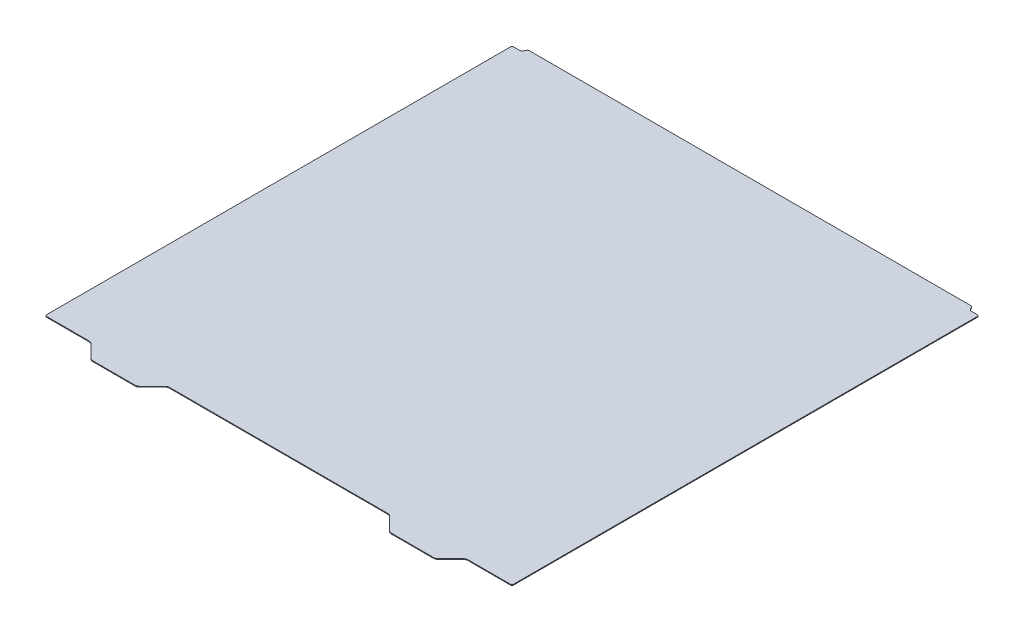
ISO-10303-21;
HEADER;
FILE_DESCRIPTION(('STEP AP214'),'2;1');
FILE_NAME('part.step','',(''),(''),'','','');
FILE_SCHEMA(('AUTOMOTIVE_DESIGN { 1 0 10303 214 1 1 1 1 }'));
ENDSEC;
DATA;
#1=APPLICATION_CONTEXT('core data for automotive mechanical design processes');
#2=APPLICATION_PROTOCOL_DEFINITION('international standard','automotive_design',2000,#1);
#3=PRODUCT_CONTEXT('',#1,'mechanical');
#4=PRODUCT('Part','Part','',(#3));
#5=PRODUCT_RELATED_PRODUCT_CATEGORY('part','',(#4));
#6=PRODUCT_DEFINITION_FORMATION('','',#4);
#7=PRODUCT_DEFINITION_CONTEXT('part definition',#1,'design');
#8=PRODUCT_DEFINITION('design','',#6,#7);
#9=PRODUCT_DEFINITION_SHAPE('','',#8);
#10=(LENGTH_UNIT() NAMED_UNIT(*) SI_UNIT(.MILLI.,.METRE.));
#11=(NAMED_UNIT(*) PLANE_ANGLE_UNIT() SI_UNIT($,.RADIAN.));
#12=(NAMED_UNIT(*) SI_UNIT($,.STERADIAN.) SOLID_ANGLE_UNIT());
#13=UNCERTAINTY_MEASURE_WITH_UNIT(LENGTH_MEASURE(1.E-05),#10,'distance_accuracy_value','');
#14=(GEOMETRIC_REPRESENTATION_CONTEXT(3) GLOBAL_UNCERTAINTY_ASSIGNED_CONTEXT((#13)) GLOBAL_UNIT_ASSIGNED_CONTEXT((#10,
#11,#12)) REPRESENTATION_CONTEXT('',''));
#15=CARTESIAN_POINT('',(0.,0.,0.));
#16=DIRECTION('',(0.,0.,1.));
#17=DIRECTION('',(1.,0.,0.));
#18=AXIS2_PLACEMENT_3D('',#15,#16,#17);
#19=CARTESIAN_POINT('',(-152.5,0.5,-152.5));
#20=DIRECTION('',(0.,0.,1.));
#21=DIRECTION('',(1.,0.,0.));
#22=AXIS2_PLACEMENT_3D('',#19,#20,#21);
#23=PLANE('',#22);
#24=DIRECTION('',(-1.,0.,0.));
#25=VECTOR('',#24,1.);
#26=CARTESIAN_POINT('',(-152.5,0.5,-152.5));
#27=LINE('',#26,#25);
#28=CARTESIAN_POINT('',(-147.500000003784,0.5,-152.5));
#29=VERTEX_POINT('',#28);
#30=CARTESIAN_POINT('',(-151.5,0.5,-152.5));
#31=VERTEX_POINT('',#30);
#32=EDGE_CURVE('E544',#29,#31,#27,.T.);
#33=ORIENTED_EDGE('',*,*,#32,.F.);
#34=DIRECTION('',(0.,1.,0.));
#35=VECTOR('',#34,1.);
#36=CARTESIAN_POINT('',(-147.500000003784,0.,-152.5));
#37=LINE('',#36,#35);
#38=CARTESIAN_POINT('',(-147.500000003784,0.,-152.5));
#39=VERTEX_POINT('',#38);
#40=EDGE_CURVE('E409',#29,#39,#37,.F.);
#41=ORIENTED_EDGE('',*,*,#40,.T.);
#42=DIRECTION('',(-1.,0.,0.));
#43=VECTOR('',#42,1.);
#44=CARTESIAN_POINT('',(-152.5,0.,-152.5));
#45=LINE('',#44,#43);
#46=CARTESIAN_POINT('',(-151.5,0.,-152.5));
#47=VERTEX_POINT('',#46);
#48=EDGE_CURVE('E557',#39,#47,#45,.T.);
#49=ORIENTED_EDGE('',*,*,#48,.T.);
#50=DIRECTION('',(0.,-1.,0.));
#51=VECTOR('',#50,1.);
#52=CARTESIAN_POINT('',(-151.5,0.5,-152.5));
#53=LINE('',#52,#51);
#54=EDGE_CURVE('E393',#47,#31,#53,.F.);
#55=ORIENTED_EDGE('',*,*,#54,.T.);
#56=EDGE_LOOP('',(#33,#41,#49,#55));
#57=FACE_BOUND('',#56,.T.);
#58=ADVANCED_FACE('F103',(#57),#23,.F.);
#59=CARTESIAN_POINT('',(-152.5,0.5,152.5));
#60=DIRECTION('',(0.,0.,-1.));
#61=DIRECTION('',(-1.,0.,0.));
#62=AXIS2_PLACEMENT_3D('',#59,#60,#61);
#63=PLANE('',#62);
#64=DIRECTION('',(1.,0.,0.));
#65=VECTOR('',#64,1.);
#66=CARTESIAN_POINT('',(-152.5,0.5,152.5));
#67=LINE('',#66,#65);
#68=CARTESIAN_POINT('',(-71.2573593128807,0.5,152.5));
#69=VERTEX_POINT('',#68);
#70=CARTESIAN_POINT('',(71.2573593128807,0.5,152.5));
#71=VERTEX_POINT('',#70);
#72=EDGE_CURVE('E346',#69,#71,#67,.T.);
#73=ORIENTED_EDGE('',*,*,#72,.F.);
#74=DIRECTION('',(0.,1.,0.));
#75=VECTOR('',#74,1.);
#76=CARTESIAN_POINT('',(-71.2573593128807,0.,152.5));
#77=LINE('',#76,#75);
#78=CARTESIAN_POINT('',(-71.2573593128807,0.,152.5));
#79=VERTEX_POINT('',#78);
#80=EDGE_CURVE('E494',#69,#79,#77,.F.);
#81=ORIENTED_EDGE('',*,*,#80,.T.);
#82=DIRECTION('',(1.,0.,0.));
#83=VECTOR('',#82,1.);
#84=CARTESIAN_POINT('',(-152.5,0.,152.5));
#85=LINE('',#84,#83);
#86=CARTESIAN_POINT('',(71.2573593128807,0.,152.5));
#87=VERTEX_POINT('',#86);
#88=EDGE_CURVE('E566',#79,#87,#85,.T.);
#89=ORIENTED_EDGE('',*,*,#88,.T.);
#90=DIRECTION('',(0.,1.,0.));
#91=VECTOR('',#90,1.);
#92=CARTESIAN_POINT('',(71.2573593128807,0.5,152.5));
#93=LINE('',#92,#91);
#94=EDGE_CURVE('E496',#87,#71,#93,.T.);
#95=ORIENTED_EDGE('',*,*,#94,.T.);
#96=EDGE_LOOP('',(#73,#81,#89,#95));
#97=FACE_BOUND('',#96,.T.);
#98=ADVANCED_FACE('F662',(#97),#63,.F.);
#99=CARTESIAN_POINT('',(123.742640687119,0.5,152.5));
#100=VERTEX_POINT('',#99);
#101=CARTESIAN_POINT('',(151.5,0.5,152.5));
#102=VERTEX_POINT('',#101);
#103=EDGE_CURVE('E348',#100,#102,#67,.T.);
#104=ORIENTED_EDGE('',*,*,#103,.F.);
#105=DIRECTION('',(0.,1.,0.));
#106=VECTOR('',#105,1.);
#107=CARTESIAN_POINT('',(123.742640687119,0.,152.5));
#108=LINE('',#107,#106);
#109=CARTESIAN_POINT('',(123.742640687119,0.,152.5));
#110=VERTEX_POINT('',#109);
#111=EDGE_CURVE('E477',#100,#110,#108,.F.);
#112=ORIENTED_EDGE('',*,*,#111,.T.);
#113=CARTESIAN_POINT('',(151.5,0.,152.5));
#114=VERTEX_POINT('',#113);
#115=EDGE_CURVE('E562',#110,#114,#85,.T.);
#116=ORIENTED_EDGE('',*,*,#115,.T.);
#117=DIRECTION('',(0.,-1.,0.));
#118=VECTOR('',#117,1.);
#119=CARTESIAN_POINT('',(151.5,0.5,152.5));
#120=LINE('',#119,#118);
#121=EDGE_CURVE('E396',#114,#102,#120,.F.);
#122=ORIENTED_EDGE('',*,*,#121,.T.);
#123=EDGE_LOOP('',(#104,#112,#116,#122));
#124=FACE_BOUND('',#123,.T.);
#125=ADVANCED_FACE('F654',(#124),#63,.F.);
#126=CARTESIAN_POINT('',(152.5,0.5,152.5));
#127=DIRECTION('',(-1.,0.,0.));
#128=DIRECTION('',(0.,0.,1.));
#129=AXIS2_PLACEMENT_3D('',#126,#127,#128);
#130=PLANE('',#129);
#131=DIRECTION('',(0.,0.,-1.));
#132=VECTOR('',#131,1.);
#133=CARTESIAN_POINT('',(152.5,0.,152.5));
#134=LINE('',#133,#132);
#135=CARTESIAN_POINT('',(152.5,0.,151.5));
#136=VERTEX_POINT('',#135);
#137=CARTESIAN_POINT('',(152.5,0.,-151.5));
#138=VERTEX_POINT('',#137);
#139=EDGE_CURVE('E462',#136,#138,#134,.T.);
#140=ORIENTED_EDGE('',*,*,#139,.T.);
#141=DIRECTION('',(0.,-1.,0.));
#142=VECTOR('',#141,1.);
#143=CARTESIAN_POINT('',(152.5,0.5,-151.5));
#144=LINE('',#143,#142);
#145=CARTESIAN_POINT('',(152.5,0.5,-151.5));
#146=VERTEX_POINT('',#145);
#147=EDGE_CURVE('E383',#138,#146,#144,.F.);
#148=ORIENTED_EDGE('',*,*,#147,.T.);
#149=DIRECTION('',(0.,0.,-1.));
#150=VECTOR('',#149,1.);
#151=CARTESIAN_POINT('',(152.5,0.5,152.5));
#152=LINE('',#151,#150);
#153=CARTESIAN_POINT('',(152.5,0.5,151.5));
#154=VERTEX_POINT('',#153);
#155=EDGE_CURVE('E545',#154,#146,#152,.T.);
#156=ORIENTED_EDGE('',*,*,#155,.F.);
#157=DIRECTION('',(0.,-1.,0.));
#158=VECTOR('',#157,1.);
#159=CARTESIAN_POINT('',(152.5,0.5,151.5));
#160=LINE('',#159,#158);
#161=EDGE_CURVE('E380',#154,#136,#160,.T.);
#162=ORIENTED_EDGE('',*,*,#161,.T.);
#163=EDGE_LOOP('',(#140,#148,#156,#162));
#164=FACE_BOUND('',#163,.T.);
#165=ADVANCED_FACE('F698',(#164),#130,.F.);
#166=CARTESIAN_POINT('',(151.5,0.,-152.5));
#167=VERTEX_POINT('',#166);
#168=CARTESIAN_POINT('',(147.500000003784,0.,-152.5));
#169=VERTEX_POINT('',#168);
#170=EDGE_CURVE('E558',#167,#169,#45,.T.);
#171=ORIENTED_EDGE('',*,*,#170,.T.);
#172=DIRECTION('',(0.,1.,0.));
#173=VECTOR('',#172,1.);
#174=CARTESIAN_POINT('',(147.500000003784,0.5,-152.5));
#175=LINE('',#174,#173);
#176=CARTESIAN_POINT('',(147.500000003784,0.5,-152.5));
#177=VERTEX_POINT('',#176);
#178=EDGE_CURVE('E402',#169,#177,#175,.T.);
#179=ORIENTED_EDGE('',*,*,#178,.T.);
#180=CARTESIAN_POINT('',(151.5,0.5,-152.5));
#181=VERTEX_POINT('',#180);
#182=EDGE_CURVE('E539',#181,#177,#27,.T.);
#183=ORIENTED_EDGE('',*,*,#182,.F.);
#184=DIRECTION('',(0.,-1.,0.));
#185=VECTOR('',#184,1.);
#186=CARTESIAN_POINT('',(151.5,0.5,-152.5));
#187=LINE('',#186,#185);
#188=EDGE_CURVE('E334',#181,#167,#187,.T.);
#189=ORIENTED_EDGE('',*,*,#188,.T.);
#190=EDGE_LOOP('',(#171,#179,#183,#189));
#191=FACE_BOUND('',#190,.T.);
#192=ADVANCED_FACE('F690',(#191),#23,.F.);
#193=CARTESIAN_POINT('',(-152.5,0.5,152.5));
#194=DIRECTION('',(1.,0.,0.));
#195=DIRECTION('',(0.,0.,-1.));
#196=AXIS2_PLACEMENT_3D('',#193,#194,#195);
#197=PLANE('',#196);
#198=DIRECTION('',(0.,0.,1.));
#199=VECTOR('',#198,1.);
#200=CARTESIAN_POINT('',(-152.5,0.5,152.5));
#201=LINE('',#200,#199);
#202=CARTESIAN_POINT('',(-152.5,0.5,-151.5));
#203=VERTEX_POINT('',#202);
#204=CARTESIAN_POINT('',(-152.5,0.5,151.5));
#205=VERTEX_POINT('',#204);
#206=EDGE_CURVE('E543',#203,#205,#201,.T.);
#207=ORIENTED_EDGE('',*,*,#206,.F.);
#208=DIRECTION('',(0.,-1.,0.));
#209=VECTOR('',#208,1.);
#210=CARTESIAN_POINT('',(-152.5,0.5,-151.5));
#211=LINE('',#210,#209);
#212=CARTESIAN_POINT('',(-152.5,0.,-151.5));
#213=VERTEX_POINT('',#212);
#214=EDGE_CURVE('E390',#203,#213,#211,.T.);
#215=ORIENTED_EDGE('',*,*,#214,.T.);
#216=DIRECTION('',(0.,0.,1.));
#217=VECTOR('',#216,1.);
#218=CARTESIAN_POINT('',(-152.5,0.,152.5));
#219=LINE('',#218,#217);
#220=CARTESIAN_POINT('',(-152.5,0.,151.5));
#221=VERTEX_POINT('',#220);
#222=EDGE_CURVE('E560',#213,#221,#219,.T.);
#223=ORIENTED_EDGE('',*,*,#222,.T.);
#224=DIRECTION('',(0.,-1.,0.));
#225=VECTOR('',#224,1.);
#226=CARTESIAN_POINT('',(-152.5,0.5,151.5));
#227=LINE('',#226,#225);
#228=EDGE_CURVE('E388',#221,#205,#227,.F.);
#229=ORIENTED_EDGE('',*,*,#228,.T.);
#230=EDGE_LOOP('',(#207,#215,#223,#229));
#231=FACE_BOUND('',#230,.T.);
#232=ADVANCED_FACE('F591',(#231),#197,.F.);
#233=CARTESIAN_POINT('',(-151.5,0.,152.5));
#234=VERTEX_POINT('',#233);
#235=CARTESIAN_POINT('',(-123.742640687119,0.,152.5));
#236=VERTEX_POINT('',#235);
#237=EDGE_CURVE('E350',#234,#236,#85,.T.);
#238=ORIENTED_EDGE('',*,*,#237,.T.);
#239=DIRECTION('',(0.,1.,0.));
#240=VECTOR('',#239,1.);
#241=CARTESIAN_POINT('',(-123.742640687119,0.5,152.5));
#242=LINE('',#241,#240);
#243=CARTESIAN_POINT('',(-123.742640687119,0.5,152.5));
#244=VERTEX_POINT('',#243);
#245=EDGE_CURVE('E529',#236,#244,#242,.T.);
#246=ORIENTED_EDGE('',*,*,#245,.T.);
#247=CARTESIAN_POINT('',(-151.5,0.5,152.5));
#248=VERTEX_POINT('',#247);
#249=EDGE_CURVE('E341',#248,#244,#67,.T.);
#250=ORIENTED_EDGE('',*,*,#249,.F.);
#251=DIRECTION('',(0.,-1.,0.));
#252=VECTOR('',#251,1.);
#253=CARTESIAN_POINT('',(-151.5,0.5,152.5));
#254=LINE('',#253,#252);
#255=EDGE_CURVE('E399',#248,#234,#254,.T.);
#256=ORIENTED_EDGE('',*,*,#255,.T.);
#257=EDGE_LOOP('',(#238,#246,#250,#256));
#258=FACE_BOUND('',#257,.T.);
#259=ADVANCED_FACE('F597',(#258),#63,.F.);
#260=CARTESIAN_POINT('',(0.,0.5,0.));
#261=DIRECTION('',(0.,-1.,0.));
#262=DIRECTION('',(0.,0.,-1.));
#263=AXIS2_PLACEMENT_3D('',#260,#261,#262);
#264=PLANE('',#263);
#265=DIRECTION('',(0.707106781186552,0.,0.707106781186543));
#266=VECTOR('',#265,1.);
#267=CARTESIAN_POINT('',(-137.499999999999,0.5,137.500000000001));
#268=LINE('',#267,#266);
#269=CARTESIAN_POINT('',(-121.62132034356,0.5,153.37867965644));
#270=VERTEX_POINT('',#269);
#271=CARTESIAN_POINT('',(-113.37867965644,0.5,161.62132034356));
#272=VERTEX_POINT('',#271);
#273=EDGE_CURVE('E428',#270,#272,#268,.T.);
#274=ORIENTED_EDGE('',*,*,#273,.T.);
#275=CARTESIAN_POINT('',(-111.257359312881,0.5,159.5));
#276=DIRECTION('',(0.,-1.,0.));
#277=DIRECTION('',(0.,0.,-1.));
#278=AXIS2_PLACEMENT_3D('',#275,#276,#277);
#279=CIRCLE('',#278,3.);
#280=CARTESIAN_POINT('',(-111.257359312881,0.5,162.5));
#281=VERTEX_POINT('',#280);
#282=EDGE_CURVE('E516',#272,#281,#279,.F.);
#283=ORIENTED_EDGE('',*,*,#282,.T.);
#284=DIRECTION('',(-1.,0.,0.));
#285=VECTOR('',#284,1.);
#286=CARTESIAN_POINT('',(0.,0.5,162.5));
#287=LINE('',#286,#285);
#288=CARTESIAN_POINT('',(-83.7426406871194,0.5,162.5));
#289=VERTEX_POINT('',#288);
#290=EDGE_CURVE('E463',#289,#281,#287,.T.);
#291=ORIENTED_EDGE('',*,*,#290,.F.);
#292=CARTESIAN_POINT('',(-83.7426406871194,0.5,159.5));
#293=DIRECTION('',(0.,-1.,0.));
#294=DIRECTION('',(0.,0.,-1.));
#295=AXIS2_PLACEMENT_3D('',#292,#293,#294);
#296=CIRCLE('',#295,3.);
#297=CARTESIAN_POINT('',(-81.6213203435598,0.5,161.62132034356));
#298=VERTEX_POINT('',#297);
#299=EDGE_CURVE('E518',#289,#298,#296,.F.);
#300=ORIENTED_EDGE('',*,*,#299,.T.);
#301=DIRECTION('',(-0.707106781186552,0.,0.707106781186543));
#302=VECTOR('',#301,1.);
#303=CARTESIAN_POINT('',(40.0000000000005,0.5,40.0000000000011));
#304=LINE('',#303,#302);
#305=CARTESIAN_POINT('',(-73.3786796564404,0.5,153.37867965644));
#306=VERTEX_POINT('',#305);
#307=EDGE_CURVE('E459',#306,#298,#304,.T.);
#308=ORIENTED_EDGE('',*,*,#307,.F.);
#309=CARTESIAN_POINT('',(-71.2573593128807,0.5,155.5));
#310=DIRECTION('',(0.,-1.,0.));
#311=DIRECTION('',(0.,0.,-1.));
#312=AXIS2_PLACEMENT_3D('',#309,#310,#311);
#313=CIRCLE('',#312,3.);
#314=EDGE_CURVE('E470',#306,#69,#313,.T.);
#315=ORIENTED_EDGE('',*,*,#314,.T.);
#316=ORIENTED_EDGE('',*,*,#72,.T.);
#317=CARTESIAN_POINT('',(71.2573593128807,0.5,155.5));
#318=DIRECTION('',(0.,-1.,0.));
#319=DIRECTION('',(0.,0.,-1.));
#320=AXIS2_PLACEMENT_3D('',#317,#318,#319);
#321=CIRCLE('',#320,3.);
#322=CARTESIAN_POINT('',(73.3786796564404,0.5,153.37867965644));
#323=VERTEX_POINT('',#322);
#324=EDGE_CURVE('E447',#71,#323,#321,.T.);
#325=ORIENTED_EDGE('',*,*,#324,.T.);
#326=DIRECTION('',(0.707106781186553,0.,0.707106781186542));
#327=VECTOR('',#326,1.);
#328=CARTESIAN_POINT('',(-40.0000000000006,0.5,40.0000000000013));
#329=LINE('',#328,#327);
#330=CARTESIAN_POINT('',(81.6213203435598,0.5,161.62132034356));
#331=VERTEX_POINT('',#330);
#332=EDGE_CURVE('E454',#323,#331,#329,.T.);
#333=ORIENTED_EDGE('',*,*,#332,.T.);
#334=CARTESIAN_POINT('',(83.7426406871194,0.5,159.5));
#335=DIRECTION('',(0.,-1.,0.));
#336=DIRECTION('',(0.,0.,-1.));
#337=AXIS2_PLACEMENT_3D('',#334,#335,#336);
#338=CIRCLE('',#337,3.);
#339=CARTESIAN_POINT('',(83.7426406871194,0.5,162.5));
#340=VERTEX_POINT('',#339);
#341=EDGE_CURVE('E520',#331,#340,#338,.F.);
#342=ORIENTED_EDGE('',*,*,#341,.T.);
#343=DIRECTION('',(1.,0.,0.));
#344=VECTOR('',#343,1.);
#345=CARTESIAN_POINT('',(0.,0.5,162.5));
#346=LINE('',#345,#344);
#347=CARTESIAN_POINT('',(111.257359312881,0.5,162.5));
#348=VERTEX_POINT('',#347);
#349=EDGE_CURVE('E429',#340,#348,#346,.T.);
#350=ORIENTED_EDGE('',*,*,#349,.T.);
#351=CARTESIAN_POINT('',(111.257359312881,0.5,159.5));
#352=DIRECTION('',(0.,-1.,0.));
#353=DIRECTION('',(0.,0.,-1.));
#354=AXIS2_PLACEMENT_3D('',#351,#352,#353);
#355=CIRCLE('',#354,3.);
#356=CARTESIAN_POINT('',(113.37867965644,0.5,161.62132034356));
#357=VERTEX_POINT('',#356);
#358=EDGE_CURVE('E522',#348,#357,#355,.F.);
#359=ORIENTED_EDGE('',*,*,#358,.T.);
#360=DIRECTION('',(-0.707106781186553,0.,0.707106781186542));
#361=VECTOR('',#360,1.);
#362=CARTESIAN_POINT('',(137.499999999999,0.5,137.500000000001));
#363=LINE('',#362,#361);
#364=CARTESIAN_POINT('',(121.62132034356,0.5,153.37867965644));
#365=VERTEX_POINT('',#364);
#366=EDGE_CURVE('E323',#365,#357,#363,.T.);
#367=ORIENTED_EDGE('',*,*,#366,.F.);
#368=CARTESIAN_POINT('',(123.742640687119,0.5,155.5));
#369=DIRECTION('',(0.,-1.,0.));
#370=DIRECTION('',(0.,0.,-1.));
#371=AXIS2_PLACEMENT_3D('',#368,#369,#370);
#372=CIRCLE('',#371,3.);
#373=EDGE_CURVE('E111',#365,#100,#372,.T.);
#374=ORIENTED_EDGE('',*,*,#373,.T.);
#375=ORIENTED_EDGE('',*,*,#103,.T.);
#376=CARTESIAN_POINT('',(151.5,0.5,151.5));
#377=DIRECTION('',(0.,-1.,0.));
#378=DIRECTION('',(0.,0.,-1.));
#379=AXIS2_PLACEMENT_3D('',#376,#377,#378);
#380=CIRCLE('',#379,1.);
#381=EDGE_CURVE('E343',#102,#154,#380,.F.);
#382=ORIENTED_EDGE('',*,*,#381,.T.);
#383=ORIENTED_EDGE('',*,*,#155,.T.);
#384=CARTESIAN_POINT('',(151.5,0.5,-151.5));
#385=DIRECTION('',(0.,-1.,0.));
#386=DIRECTION('',(0.,0.,-1.));
#387=AXIS2_PLACEMENT_3D('',#384,#385,#386);
#388=CIRCLE('',#387,1.);
#389=EDGE_CURVE('E359',#146,#181,#388,.F.);
#390=ORIENTED_EDGE('',*,*,#389,.T.);
#391=ORIENTED_EDGE('',*,*,#182,.T.);
#392=CARTESIAN_POINT('',(147.500000003784,0.5,-154.));
#393=DIRECTION('',(0.,-1.,0.));
#394=DIRECTION('',(0.,0.,-1.));
#395=AXIS2_PLACEMENT_3D('',#392,#393,#394);
#396=CIRCLE('',#395,1.5);
#397=CARTESIAN_POINT('',(146.200961898108,0.5,-153.25));
#398=VERTEX_POINT('',#397);
#399=EDGE_CURVE('E411',#177,#398,#396,.T.);
#400=ORIENTED_EDGE('',*,*,#399,.T.);
#401=DIRECTION('',(-0.499999999999995,0.,-0.866025403784441));
#402=VECTOR('',#401,1.);
#403=CARTESIAN_POINT('',(176.009917988564,0.5,-101.61937353074));
#404=LINE('',#403,#402);
#405=CARTESIAN_POINT('',(145.190598927026,0.5,-155.));
#406=VERTEX_POINT('',#405);
#407=EDGE_CURVE('E425',#398,#406,#404,.T.);
#408=ORIENTED_EDGE('',*,*,#407,.T.);
#409=CARTESIAN_POINT('',(144.324573523242,0.5,-154.5));
#410=DIRECTION('',(0.,-1.,0.));
#411=DIRECTION('',(0.,0.,-1.));
#412=AXIS2_PLACEMENT_3D('',#409,#410,#411);
#413=CIRCLE('',#412,1.);
#414=CARTESIAN_POINT('',(144.324573523242,0.5,-155.5));
#415=VERTEX_POINT('',#414);
#416=EDGE_CURVE('E339',#406,#415,#413,.F.);
#417=ORIENTED_EDGE('',*,*,#416,.T.);
#418=DIRECTION('',(1.,0.,0.));
#419=VECTOR('',#418,1.);
#420=CARTESIAN_POINT('',(0.,0.5,-155.5));
#421=LINE('',#420,#419);
#422=CARTESIAN_POINT('',(-144.324573523242,0.5,-155.5));
#423=VERTEX_POINT('',#422);
#424=EDGE_CURVE('E322',#423,#415,#421,.T.);
#425=ORIENTED_EDGE('',*,*,#424,.F.);
#426=CARTESIAN_POINT('',(-144.324573523242,0.5,-154.5));
#427=DIRECTION('',(0.,-1.,0.));
#428=DIRECTION('',(0.,0.,-1.));
#429=AXIS2_PLACEMENT_3D('',#426,#427,#428);
#430=CIRCLE('',#429,1.);
#431=CARTESIAN_POINT('',(-145.190598927026,0.5,-155.));
#432=VERTEX_POINT('',#431);
#433=EDGE_CURVE('E356',#423,#432,#430,.F.);
#434=ORIENTED_EDGE('',*,*,#433,.T.);
#435=DIRECTION('',(0.499999999999995,0.,-0.866025403784441));
#436=VECTOR('',#435,1.);
#437=CARTESIAN_POINT('',(-176.009917988564,0.5,-101.61937353074));
#438=LINE('',#437,#436);
#439=CARTESIAN_POINT('',(-146.200961898108,0.5,-153.25));
#440=VERTEX_POINT('',#439);
#441=EDGE_CURVE('E612',#440,#432,#438,.T.);
#442=ORIENTED_EDGE('',*,*,#441,.F.);
#443=CARTESIAN_POINT('',(-147.500000003784,0.5,-154.));
#444=DIRECTION('',(0.,-1.,0.));
#445=DIRECTION('',(0.,0.,-1.));
#446=AXIS2_PLACEMENT_3D('',#443,#444,#445);
#447=CIRCLE('',#446,1.5);
#448=EDGE_CURVE('E533',#440,#29,#447,.T.);
#449=ORIENTED_EDGE('',*,*,#448,.T.);
#450=ORIENTED_EDGE('',*,*,#32,.T.);
#451=CARTESIAN_POINT('',(-151.5,0.5,-151.5));
#452=DIRECTION('',(0.,-1.,0.));
#453=DIRECTION('',(0.,0.,-1.));
#454=AXIS2_PLACEMENT_3D('',#451,#452,#453);
#455=CIRCLE('',#454,1.);
#456=EDGE_CURVE('E354',#31,#203,#455,.F.);
#457=ORIENTED_EDGE('',*,*,#456,.T.);
#458=ORIENTED_EDGE('',*,*,#206,.T.);
#459=CARTESIAN_POINT('',(-151.5,0.5,151.5));
#460=DIRECTION('',(0.,-1.,0.));
#461=DIRECTION('',(0.,0.,-1.));
#462=AXIS2_PLACEMENT_3D('',#459,#460,#461);
#463=CIRCLE('',#462,1.);
#464=EDGE_CURVE('E340',#205,#248,#463,.F.);
#465=ORIENTED_EDGE('',*,*,#464,.T.);
#466=ORIENTED_EDGE('',*,*,#249,.T.);
#467=CARTESIAN_POINT('',(-123.742640687119,0.5,155.5));
#468=DIRECTION('',(0.,-1.,0.));
#469=DIRECTION('',(0.,0.,-1.));
#470=AXIS2_PLACEMENT_3D('',#467,#468,#469);
#471=CIRCLE('',#470,3.);
#472=EDGE_CURVE('E474',#244,#270,#471,.T.);
#473=ORIENTED_EDGE('',*,*,#472,.T.);
#474=EDGE_LOOP('',(#274,#283,#291,#300,#308,#315,#316,#325,#333,#342,#350,#359,#367,#374,#375,
#382,#383,#390,#391,#400,#408,#417,#425,#434,#442,#449,#450,#457,#458,#465,#466,#473));
#475=FACE_BOUND('',#474,.T.);
#476=ADVANCED_FACE('F580',(#475),#264,.F.);
#477=CARTESIAN_POINT('',(0.,0.,0.));
#478=DIRECTION('',(0.,-1.,0.));
#479=DIRECTION('',(0.,0.,-1.));
#480=AXIS2_PLACEMENT_3D('',#477,#478,#479);
#481=PLANE('',#480);
#482=DIRECTION('',(-1.,0.,0.));
#483=VECTOR('',#482,1.);
#484=CARTESIAN_POINT('',(0.,0.,162.5));
#485=LINE('',#484,#483);
#486=CARTESIAN_POINT('',(-83.7426406871194,0.,162.5));
#487=VERTEX_POINT('',#486);
#488=CARTESIAN_POINT('',(-111.257359312881,0.,162.5));
#489=VERTEX_POINT('',#488);
#490=EDGE_CURVE('E616',#487,#489,#485,.T.);
#491=ORIENTED_EDGE('',*,*,#490,.T.);
#492=CARTESIAN_POINT('',(-111.257359312881,0.,159.5));
#493=DIRECTION('',(0.,-1.,0.));
#494=DIRECTION('',(0.,0.,-1.));
#495=AXIS2_PLACEMENT_3D('',#492,#493,#494);
#496=CIRCLE('',#495,3.);
#497=CARTESIAN_POINT('',(-113.37867965644,0.,161.62132034356));
#498=VERTEX_POINT('',#497);
#499=EDGE_CURVE('E503',#489,#498,#496,.T.);
#500=ORIENTED_EDGE('',*,*,#499,.T.);
#501=DIRECTION('',(0.707106781186552,0.,0.707106781186543));
#502=VECTOR('',#501,1.);
#503=CARTESIAN_POINT('',(-137.499999999999,0.,137.500000000001));
#504=LINE('',#503,#502);
#505=CARTESIAN_POINT('',(-121.62132034356,0.,153.37867965644));
#506=VERTEX_POINT('',#505);
#507=EDGE_CURVE('E610',#506,#498,#504,.T.);
#508=ORIENTED_EDGE('',*,*,#507,.F.);
#509=CARTESIAN_POINT('',(-123.742640687119,0.,155.5));
#510=DIRECTION('',(0.,-1.,0.));
#511=DIRECTION('',(0.,0.,-1.));
#512=AXIS2_PLACEMENT_3D('',#509,#510,#511);
#513=CIRCLE('',#512,3.);
#514=EDGE_CURVE('E473',#506,#236,#513,.F.);
#515=ORIENTED_EDGE('',*,*,#514,.T.);
#516=ORIENTED_EDGE('',*,*,#237,.F.);
#517=CARTESIAN_POINT('',(-151.5,0.,151.5));
#518=DIRECTION('',(0.,-1.,0.));
#519=DIRECTION('',(0.,0.,-1.));
#520=AXIS2_PLACEMENT_3D('',#517,#518,#519);
#521=CIRCLE('',#520,1.);
#522=EDGE_CURVE('E367',#234,#221,#521,.T.);
#523=ORIENTED_EDGE('',*,*,#522,.T.);
#524=ORIENTED_EDGE('',*,*,#222,.F.);
#525=CARTESIAN_POINT('',(-151.5,0.,-151.5));
#526=DIRECTION('',(0.,-1.,0.));
#527=DIRECTION('',(0.,0.,-1.));
#528=AXIS2_PLACEMENT_3D('',#525,#526,#527);
#529=CIRCLE('',#528,1.);
#530=EDGE_CURVE('E372',#213,#47,#529,.T.);
#531=ORIENTED_EDGE('',*,*,#530,.T.);
#532=ORIENTED_EDGE('',*,*,#48,.F.);
#533=CARTESIAN_POINT('',(-147.500000003784,0.,-154.));
#534=DIRECTION('',(0.,-1.,0.));
#535=DIRECTION('',(0.,0.,-1.));
#536=AXIS2_PLACEMENT_3D('',#533,#534,#535);
#537=CIRCLE('',#536,1.5);
#538=CARTESIAN_POINT('',(-146.200961898108,0.,-153.25));
#539=VERTEX_POINT('',#538);
#540=EDGE_CURVE('E532',#39,#539,#537,.F.);
#541=ORIENTED_EDGE('',*,*,#540,.T.);
#542=DIRECTION('',(0.499999999999995,0.,-0.866025403784441));
#543=VECTOR('',#542,1.);
#544=CARTESIAN_POINT('',(-176.009917988564,0.,-101.61937353074));
#545=LINE('',#544,#543);
#546=CARTESIAN_POINT('',(-145.190598927026,0.,-155.));
#547=VERTEX_POINT('',#546);
#548=EDGE_CURVE('E617',#539,#547,#545,.T.);
#549=ORIENTED_EDGE('',*,*,#548,.T.);
#550=CARTESIAN_POINT('',(-144.324573523242,0.,-154.5));
#551=DIRECTION('',(0.,-1.,0.));
#552=DIRECTION('',(0.,0.,-1.));
#553=AXIS2_PLACEMENT_3D('',#550,#551,#552);
#554=CIRCLE('',#553,1.);
#555=CARTESIAN_POINT('',(-144.324573523242,0.,-155.5));
#556=VERTEX_POINT('',#555);
#557=EDGE_CURVE('E375',#547,#556,#554,.T.);
#558=ORIENTED_EDGE('',*,*,#557,.T.);
#559=DIRECTION('',(1.,0.,0.));
#560=VECTOR('',#559,1.);
#561=CARTESIAN_POINT('',(0.,0.,-155.5));
#562=LINE('',#561,#560);
#563=CARTESIAN_POINT('',(144.324573523242,0.,-155.5));
#564=VERTEX_POINT('',#563);
#565=EDGE_CURVE('E331',#556,#564,#562,.T.);
#566=ORIENTED_EDGE('',*,*,#565,.T.);
#567=CARTESIAN_POINT('',(144.324573523242,0.,-154.5));
#568=DIRECTION('',(0.,-1.,0.));
#569=DIRECTION('',(0.,0.,-1.));
#570=AXIS2_PLACEMENT_3D('',#567,#568,#569);
#571=CIRCLE('',#570,1.);
#572=CARTESIAN_POINT('',(145.190598927026,0.,-155.));
#573=VERTEX_POINT('',#572);
#574=EDGE_CURVE('E327',#564,#573,#571,.T.);
#575=ORIENTED_EDGE('',*,*,#574,.T.);
#576=DIRECTION('',(-0.499999999999995,0.,-0.866025403784441));
#577=VECTOR('',#576,1.);
#578=CARTESIAN_POINT('',(176.009917988564,0.,-101.61937353074));
#579=LINE('',#578,#577);
#580=CARTESIAN_POINT('',(146.200961898108,0.,-153.25));
#581=VERTEX_POINT('',#580);
#582=EDGE_CURVE('E313',#581,#573,#579,.T.);
#583=ORIENTED_EDGE('',*,*,#582,.F.);
#584=CARTESIAN_POINT('',(147.500000003784,0.,-154.));
#585=DIRECTION('',(0.,-1.,0.));
#586=DIRECTION('',(0.,0.,-1.));
#587=AXIS2_PLACEMENT_3D('',#584,#585,#586);
#588=CIRCLE('',#587,1.5);
#589=EDGE_CURVE('E414',#581,#169,#588,.F.);
#590=ORIENTED_EDGE('',*,*,#589,.T.);
#591=ORIENTED_EDGE('',*,*,#170,.F.);
#592=CARTESIAN_POINT('',(151.5,0.,-151.5));
#593=DIRECTION('',(0.,-1.,0.));
#594=DIRECTION('',(0.,0.,-1.));
#595=AXIS2_PLACEMENT_3D('',#592,#593,#594);
#596=CIRCLE('',#595,1.);
#597=EDGE_CURVE('E335',#167,#138,#596,.T.);
#598=ORIENTED_EDGE('',*,*,#597,.T.);
#599=ORIENTED_EDGE('',*,*,#139,.F.);
#600=CARTESIAN_POINT('',(151.5,0.,151.5));
#601=DIRECTION('',(0.,-1.,0.));
#602=DIRECTION('',(0.,0.,-1.));
#603=AXIS2_PLACEMENT_3D('',#600,#601,#602);
#604=CIRCLE('',#603,1.);
#605=EDGE_CURVE('E369',#136,#114,#604,.T.);
#606=ORIENTED_EDGE('',*,*,#605,.T.);
#607=ORIENTED_EDGE('',*,*,#115,.F.);
#608=CARTESIAN_POINT('',(123.742640687119,0.,155.5));
#609=DIRECTION('',(0.,-1.,0.));
#610=DIRECTION('',(0.,0.,-1.));
#611=AXIS2_PLACEMENT_3D('',#608,#609,#610);
#612=CIRCLE('',#611,3.);
#613=CARTESIAN_POINT('',(121.62132034356,0.,153.37867965644));
#614=VERTEX_POINT('',#613);
#615=EDGE_CURVE('E13',#110,#614,#612,.F.);
#616=ORIENTED_EDGE('',*,*,#615,.T.);
#617=DIRECTION('',(-0.707106781186553,0.,0.707106781186542));
#618=VECTOR('',#617,1.);
#619=CARTESIAN_POINT('',(137.499999999999,0.,137.500000000001));
#620=LINE('',#619,#618);
#621=CARTESIAN_POINT('',(113.37867965644,0.,161.62132034356));
#622=VERTEX_POINT('',#621);
#623=EDGE_CURVE('E458',#614,#622,#620,.T.);
#624=ORIENTED_EDGE('',*,*,#623,.T.);
#625=CARTESIAN_POINT('',(111.257359312881,0.,159.5));
#626=DIRECTION('',(0.,-1.,0.));
#627=DIRECTION('',(0.,0.,-1.));
#628=AXIS2_PLACEMENT_3D('',#625,#626,#627);
#629=CIRCLE('',#628,3.);
#630=CARTESIAN_POINT('',(111.257359312881,0.,162.5));
#631=VERTEX_POINT('',#630);
#632=EDGE_CURVE('E509',#622,#631,#629,.T.);
#633=ORIENTED_EDGE('',*,*,#632,.T.);
#634=DIRECTION('',(1.,0.,0.));
#635=VECTOR('',#634,1.);
#636=CARTESIAN_POINT('',(0.,0.,162.5));
#637=LINE('',#636,#635);
#638=CARTESIAN_POINT('',(83.7426406871194,0.,162.5));
#639=VERTEX_POINT('',#638);
#640=EDGE_CURVE('E435',#639,#631,#637,.T.);
#641=ORIENTED_EDGE('',*,*,#640,.F.);
#642=CARTESIAN_POINT('',(83.7426406871194,0.,159.5));
#643=DIRECTION('',(0.,-1.,0.));
#644=DIRECTION('',(0.,0.,-1.));
#645=AXIS2_PLACEMENT_3D('',#642,#643,#644);
#646=CIRCLE('',#645,3.);
#647=CARTESIAN_POINT('',(81.6213203435598,0.,161.62132034356));
#648=VERTEX_POINT('',#647);
#649=EDGE_CURVE('E507',#639,#648,#646,.T.);
#650=ORIENTED_EDGE('',*,*,#649,.T.);
#651=DIRECTION('',(0.707106781186553,0.,0.707106781186542));
#652=VECTOR('',#651,1.);
#653=CARTESIAN_POINT('',(-40.0000000000006,0.,40.0000000000013));
#654=LINE('',#653,#652);
#655=CARTESIAN_POINT('',(73.3786796564404,0.,153.37867965644));
#656=VERTEX_POINT('',#655);
#657=EDGE_CURVE('E606',#656,#648,#654,.T.);
#658=ORIENTED_EDGE('',*,*,#657,.F.);
#659=CARTESIAN_POINT('',(71.2573593128807,0.,155.5));
#660=DIRECTION('',(0.,-1.,0.));
#661=DIRECTION('',(0.,0.,-1.));
#662=AXIS2_PLACEMENT_3D('',#659,#660,#661);
#663=CIRCLE('',#662,3.);
#664=EDGE_CURVE('E445',#656,#87,#663,.F.);
#665=ORIENTED_EDGE('',*,*,#664,.T.);
#666=ORIENTED_EDGE('',*,*,#88,.F.);
#667=CARTESIAN_POINT('',(-71.2573593128807,0.,155.5));
#668=DIRECTION('',(0.,-1.,0.));
#669=DIRECTION('',(0.,0.,-1.));
#670=AXIS2_PLACEMENT_3D('',#667,#668,#669);
#671=CIRCLE('',#670,3.);
#672=CARTESIAN_POINT('',(-73.3786796564404,0.,153.37867965644));
#673=VERTEX_POINT('',#672);
#674=EDGE_CURVE('E125',#79,#673,#671,.F.);
#675=ORIENTED_EDGE('',*,*,#674,.T.);
#676=DIRECTION('',(-0.707106781186552,0.,0.707106781186543));
#677=VECTOR('',#676,1.);
#678=CARTESIAN_POINT('',(40.0000000000005,0.,40.0000000000011));
#679=LINE('',#678,#677);
#680=CARTESIAN_POINT('',(-81.6213203435598,0.,161.62132034356));
#681=VERTEX_POINT('',#680);
#682=EDGE_CURVE('E464',#673,#681,#679,.T.);
#683=ORIENTED_EDGE('',*,*,#682,.T.);
#684=CARTESIAN_POINT('',(-83.7426406871194,0.,159.5));
#685=DIRECTION('',(0.,-1.,0.));
#686=DIRECTION('',(0.,0.,-1.));
#687=AXIS2_PLACEMENT_3D('',#684,#685,#686);
#688=CIRCLE('',#687,3.);
#689=EDGE_CURVE('E505',#681,#487,#688,.T.);
#690=ORIENTED_EDGE('',*,*,#689,.T.);
#691=EDGE_LOOP('',(#491,#500,#508,#515,#516,#523,#524,#531,#532,#541,#549,#558,#566,#575,#583,
#590,#591,#598,#599,#606,#607,#616,#624,#633,#641,#650,#658,#665,#666,#675,#683,#690));
#692=FACE_BOUND('',#691,.T.);
#693=ADVANCED_FACE('F329',(#692),#481,.T.);
#694=CARTESIAN_POINT('',(0.,-440.62342198299,162.5));
#695=DIRECTION('',(0.,0.,1.));
#696=DIRECTION('',(1.,0.,0.));
#697=AXIS2_PLACEMENT_3D('',#694,#695,#696);
#698=PLANE('',#697);
#699=ORIENTED_EDGE('',*,*,#349,.F.);
#700=DIRECTION('',(0.,1.,0.));
#701=VECTOR('',#700,1.);
#702=CARTESIAN_POINT('',(83.7426406871194,-440.62342198299,162.5));
#703=LINE('',#702,#701);
#704=EDGE_CURVE('E484',#340,#639,#703,.F.);
#705=ORIENTED_EDGE('',*,*,#704,.T.);
#706=ORIENTED_EDGE('',*,*,#640,.T.);
#707=DIRECTION('',(0.,1.,0.));
#708=VECTOR('',#707,1.);
#709=CARTESIAN_POINT('',(111.257359312881,0.5,162.5));
#710=LINE('',#709,#708);
#711=EDGE_CURVE('E486',#631,#348,#710,.T.);
#712=ORIENTED_EDGE('',*,*,#711,.T.);
#713=EDGE_LOOP('',(#699,#705,#706,#712));
#714=FACE_BOUND('',#713,.T.);
#715=ADVANCED_FACE('F638',(#714),#698,.T.);
#716=CARTESIAN_POINT('',(-40.0000000000006,-440.62342198299,40.0000000000013));
#717=DIRECTION('',(-0.707106781186542,0.,0.707106781186553));
#718=DIRECTION('',(0.707106781186553,0.,0.707106781186542));
#719=AXIS2_PLACEMENT_3D('',#716,#717,#718);
#720=PLANE('',#719);
#721=ORIENTED_EDGE('',*,*,#332,.F.);
#722=DIRECTION('',(0.,1.,0.));
#723=VECTOR('',#722,1.);
#724=CARTESIAN_POINT('',(73.3786796564403,-440.62342198299,153.37867965644));
#725=LINE('',#724,#723);
#726=EDGE_CURVE('E489',#323,#656,#725,.F.);
#727=ORIENTED_EDGE('',*,*,#726,.T.);
#728=ORIENTED_EDGE('',*,*,#657,.T.);
#729=DIRECTION('',(0.,1.,0.));
#730=VECTOR('',#729,1.);
#731=CARTESIAN_POINT('',(81.6213203435598,-440.62342198299,161.62132034356));
#732=LINE('',#731,#730);
#733=EDGE_CURVE('E491',#648,#331,#732,.T.);
#734=ORIENTED_EDGE('',*,*,#733,.T.);
#735=EDGE_LOOP('',(#721,#727,#728,#734));
#736=FACE_BOUND('',#735,.T.);
#737=ADVANCED_FACE('F628',(#736),#720,.T.);
#738=CARTESIAN_POINT('',(137.499999999999,-440.62342198299,137.500000000001));
#739=DIRECTION('',(-0.707106781186542,0.,-0.707106781186553));
#740=DIRECTION('',(-0.707106781186553,0.,0.707106781186542));
#741=AXIS2_PLACEMENT_3D('',#738,#739,#740);
#742=PLANE('',#741);
#743=ORIENTED_EDGE('',*,*,#366,.T.);
#744=DIRECTION('',(0.,1.,0.));
#745=VECTOR('',#744,1.);
#746=CARTESIAN_POINT('',(113.37867965644,0.,161.62132034356));
#747=LINE('',#746,#745);
#748=EDGE_CURVE('E479',#357,#622,#747,.F.);
#749=ORIENTED_EDGE('',*,*,#748,.T.);
#750=ORIENTED_EDGE('',*,*,#623,.F.);
#751=DIRECTION('',(0.,1.,0.));
#752=VECTOR('',#751,1.);
#753=CARTESIAN_POINT('',(121.62132034356,0.5,153.37867965644));
#754=LINE('',#753,#752);
#755=EDGE_CURVE('E481',#614,#365,#754,.T.);
#756=ORIENTED_EDGE('',*,*,#755,.T.);
#757=EDGE_LOOP('',(#743,#749,#750,#756));
#758=FACE_BOUND('',#757,.T.);
#759=ADVANCED_FACE('F647',(#758),#742,.F.);
#760=CARTESIAN_POINT('',(0.,-440.62342198299,162.5));
#761=DIRECTION('',(0.,0.,-1.));
#762=DIRECTION('',(-1.,0.,0.));
#763=AXIS2_PLACEMENT_3D('',#760,#761,#762);
#764=PLANE('',#763);
#765=ORIENTED_EDGE('',*,*,#290,.T.);
#766=DIRECTION('',(0.,1.,0.));
#767=VECTOR('',#766,1.);
#768=CARTESIAN_POINT('',(-111.257359312881,0.,162.5));
#769=LINE('',#768,#767);
#770=EDGE_CURVE('E511',#281,#489,#769,.F.);
#771=ORIENTED_EDGE('',*,*,#770,.T.);
#772=ORIENTED_EDGE('',*,*,#490,.F.);
#773=DIRECTION('',(0.,1.,0.));
#774=VECTOR('',#773,1.);
#775=CARTESIAN_POINT('',(-83.7426406871194,-440.62342198299,162.5));
#776=LINE('',#775,#774);
#777=EDGE_CURVE('E513',#487,#289,#776,.T.);
#778=ORIENTED_EDGE('',*,*,#777,.T.);
#779=EDGE_LOOP('',(#765,#771,#772,#778));
#780=FACE_BOUND('',#779,.T.);
#781=ADVANCED_FACE('F675',(#780),#764,.F.);
#782=CARTESIAN_POINT('',(-137.499999999999,-440.62342198299,137.500000000001));
#783=DIRECTION('',(-0.707106781186543,0.,0.707106781186552));
#784=DIRECTION('',(0.707106781186552,0.,0.707106781186543));
#785=AXIS2_PLACEMENT_3D('',#782,#783,#784);
#786=PLANE('',#785);
#787=ORIENTED_EDGE('',*,*,#273,.F.);
#788=DIRECTION('',(0.,1.,0.));
#789=VECTOR('',#788,1.);
#790=CARTESIAN_POINT('',(-121.62132034356,-440.62342198299,153.37867965644));
#791=LINE('',#790,#789);
#792=EDGE_CURVE('E524',#270,#506,#791,.F.);
#793=ORIENTED_EDGE('',*,*,#792,.T.);
#794=ORIENTED_EDGE('',*,*,#507,.T.);
#795=DIRECTION('',(0.,1.,0.));
#796=VECTOR('',#795,1.);
#797=CARTESIAN_POINT('',(-113.37867965644,0.5,161.62132034356));
#798=LINE('',#797,#796);
#799=EDGE_CURVE('E526',#498,#272,#798,.T.);
#800=ORIENTED_EDGE('',*,*,#799,.T.);
#801=EDGE_LOOP('',(#787,#793,#794,#800));
#802=FACE_BOUND('',#801,.T.);
#803=ADVANCED_FACE('F602',(#802),#786,.T.);
#804=CARTESIAN_POINT('',(40.0000000000005,-440.62342198299,40.0000000000011));
#805=DIRECTION('',(-0.707106781186543,0.,-0.707106781186552));
#806=DIRECTION('',(-0.707106781186552,0.,0.707106781186543));
#807=AXIS2_PLACEMENT_3D('',#804,#805,#806);
#808=PLANE('',#807);
#809=ORIENTED_EDGE('',*,*,#307,.T.);
#810=DIRECTION('',(0.,1.,0.));
#811=VECTOR('',#810,1.);
#812=CARTESIAN_POINT('',(-81.6213203435598,-440.62342198299,161.62132034356));
#813=LINE('',#812,#811);
#814=EDGE_CURVE('E118',#298,#681,#813,.F.);
#815=ORIENTED_EDGE('',*,*,#814,.T.);
#816=ORIENTED_EDGE('',*,*,#682,.F.);
#817=DIRECTION('',(0.,1.,0.));
#818=VECTOR('',#817,1.);
#819=CARTESIAN_POINT('',(-73.3786796564404,0.5,153.37867965644));
#820=LINE('',#819,#818);
#821=EDGE_CURVE('E500',#673,#306,#820,.T.);
#822=ORIENTED_EDGE('',*,*,#821,.T.);
#823=EDGE_LOOP('',(#809,#815,#816,#822));
#824=FACE_BOUND('',#823,.T.);
#825=ADVANCED_FACE('F667',(#824),#808,.F.);
#826=CARTESIAN_POINT('',(-176.009917988564,-440.62342198299,-101.61937353074));
#827=DIRECTION('',(0.866025403784441,0.,0.499999999999995));
#828=DIRECTION('',(0.499999999999995,0.,-0.866025403784441));
#829=AXIS2_PLACEMENT_3D('',#826,#827,#828);
#830=PLANE('',#829);
#831=ORIENTED_EDGE('',*,*,#548,.F.);
#832=DIRECTION('',(0.,1.,0.));
#833=VECTOR('',#832,1.);
#834=CARTESIAN_POINT('',(-146.200961898108,0.5,-153.25));
#835=LINE('',#834,#833);
#836=EDGE_CURVE('E406',#539,#440,#835,.T.);
#837=ORIENTED_EDGE('',*,*,#836,.T.);
#838=ORIENTED_EDGE('',*,*,#441,.T.);
#839=DIRECTION('',(0.,1.,0.));
#840=VECTOR('',#839,1.);
#841=CARTESIAN_POINT('',(-145.190598927026,-440.62342198299,-155.));
#842=LINE('',#841,#840);
#843=EDGE_CURVE('E385',#432,#547,#842,.F.);
#844=ORIENTED_EDGE('',*,*,#843,.T.);
#845=EDGE_LOOP('',(#831,#837,#838,#844));
#846=FACE_BOUND('',#845,.T.);
#847=ADVANCED_FACE('F739',(#846),#830,.F.);
#848=CARTESIAN_POINT('',(0.,-440.62342198299,-155.5));
#849=DIRECTION('',(0.,0.,1.));
#850=DIRECTION('',(1.,0.,0.));
#851=AXIS2_PLACEMENT_3D('',#848,#849,#850);
#852=PLANE('',#851);
#853=ORIENTED_EDGE('',*,*,#424,.T.);
#854=DIRECTION('',(0.,1.,0.));
#855=VECTOR('',#854,1.);
#856=CARTESIAN_POINT('',(144.324573523242,0.,-155.5));
#857=LINE('',#856,#855);
#858=EDGE_CURVE('E365',#415,#564,#857,.F.);
#859=ORIENTED_EDGE('',*,*,#858,.T.);
#860=ORIENTED_EDGE('',*,*,#565,.F.);
#861=DIRECTION('',(0.,1.,0.));
#862=VECTOR('',#861,1.);
#863=CARTESIAN_POINT('',(-144.324573523242,-440.62342198299,-155.5));
#864=LINE('',#863,#862);
#865=EDGE_CURVE('E362',#556,#423,#864,.T.);
#866=ORIENTED_EDGE('',*,*,#865,.T.);
#867=EDGE_LOOP('',(#853,#859,#860,#866));
#868=FACE_BOUND('',#867,.T.);
#869=ADVANCED_FACE('F746',(#868),#852,.F.);
#870=CARTESIAN_POINT('',(176.009917988564,-440.62342198299,-101.61937353074));
#871=DIRECTION('',(0.866025403784441,0.,-0.499999999999995));
#872=DIRECTION('',(-0.499999999999995,0.,-0.866025403784441));
#873=AXIS2_PLACEMENT_3D('',#870,#871,#872);
#874=PLANE('',#873);
#875=ORIENTED_EDGE('',*,*,#407,.F.);
#876=DIRECTION('',(0.,1.,0.));
#877=VECTOR('',#876,1.);
#878=CARTESIAN_POINT('',(146.200961898108,-440.62342198299,-153.25));
#879=LINE('',#878,#877);
#880=EDGE_CURVE('E320',#398,#581,#879,.F.);
#881=ORIENTED_EDGE('',*,*,#880,.T.);
#882=ORIENTED_EDGE('',*,*,#582,.T.);
#883=DIRECTION('',(0.,1.,0.));
#884=VECTOR('',#883,1.);
#885=CARTESIAN_POINT('',(145.190598927026,0.5,-155.));
#886=LINE('',#885,#884);
#887=EDGE_CURVE('E318',#573,#406,#886,.T.);
#888=ORIENTED_EDGE('',*,*,#887,.T.);
#889=EDGE_LOOP('',(#875,#881,#882,#888));
#890=FACE_BOUND('',#889,.T.);
#891=ADVANCED_FACE('F316',(#890),#874,.T.);
#892=CARTESIAN_POINT('',(144.324573523242,-440.62342198299,-154.5));
#893=DIRECTION('',(0.,-1.,0.));
#894=DIRECTION('',(0.,0.,-1.));
#895=AXIS2_PLACEMENT_3D('',#892,#893,#894);
#896=CYLINDRICAL_SURFACE('',#895,1.);
#897=ORIENTED_EDGE('',*,*,#574,.F.);
#898=ORIENTED_EDGE('',*,*,#858,.F.);
#899=ORIENTED_EDGE('',*,*,#416,.F.);
#900=ORIENTED_EDGE('',*,*,#887,.F.);
#901=EDGE_LOOP('',(#897,#898,#899,#900));
#902=FACE_BOUND('',#901,.T.);
#903=ADVANCED_FACE('F338',(#902),#896,.T.);
#904=CARTESIAN_POINT('',(151.5,0.5,-151.5));
#905=DIRECTION('',(0.,-1.,0.));
#906=DIRECTION('',(0.,0.,-1.));
#907=AXIS2_PLACEMENT_3D('',#904,#905,#906);
#908=CYLINDRICAL_SURFACE('',#907,1.);
#909=ORIENTED_EDGE('',*,*,#389,.F.);
#910=ORIENTED_EDGE('',*,*,#147,.F.);
#911=ORIENTED_EDGE('',*,*,#597,.F.);
#912=ORIENTED_EDGE('',*,*,#188,.F.);
#913=EDGE_LOOP('',(#909,#910,#911,#912));
#914=FACE_BOUND('',#913,.T.);
#915=ADVANCED_FACE('F712',(#914),#908,.T.);
#916=CARTESIAN_POINT('',(-144.324573523242,-440.62342198299,-154.5));
#917=DIRECTION('',(0.,1.,0.));
#918=DIRECTION('',(0.,0.,1.));
#919=AXIS2_PLACEMENT_3D('',#916,#917,#918);
#920=CYLINDRICAL_SURFACE('',#919,1.);
#921=ORIENTED_EDGE('',*,*,#557,.F.);
#922=ORIENTED_EDGE('',*,*,#843,.F.);
#923=ORIENTED_EDGE('',*,*,#433,.F.);
#924=ORIENTED_EDGE('',*,*,#865,.F.);
#925=EDGE_LOOP('',(#921,#922,#923,#924));
#926=FACE_BOUND('',#925,.T.);
#927=ADVANCED_FACE('F725',(#926),#920,.T.);
#928=CARTESIAN_POINT('',(-151.5,0.5,-151.5));
#929=DIRECTION('',(0.,-1.,0.));
#930=DIRECTION('',(0.,0.,-1.));
#931=AXIS2_PLACEMENT_3D('',#928,#929,#930);
#932=CYLINDRICAL_SURFACE('',#931,1.);
#933=ORIENTED_EDGE('',*,*,#456,.F.);
#934=ORIENTED_EDGE('',*,*,#54,.F.);
#935=ORIENTED_EDGE('',*,*,#530,.F.);
#936=ORIENTED_EDGE('',*,*,#214,.F.);
#937=EDGE_LOOP('',(#933,#934,#935,#936));
#938=FACE_BOUND('',#937,.T.);
#939=ADVANCED_FACE('F590',(#938),#932,.T.);
#940=CARTESIAN_POINT('',(151.5,0.5,151.5));
#941=DIRECTION('',(0.,-1.,0.));
#942=DIRECTION('',(0.,0.,-1.));
#943=AXIS2_PLACEMENT_3D('',#940,#941,#942);
#944=CYLINDRICAL_SURFACE('',#943,1.);
#945=ORIENTED_EDGE('',*,*,#381,.F.);
#946=ORIENTED_EDGE('',*,*,#121,.F.);
#947=ORIENTED_EDGE('',*,*,#605,.F.);
#948=ORIENTED_EDGE('',*,*,#161,.F.);
#949=EDGE_LOOP('',(#945,#946,#947,#948));
#950=FACE_BOUND('',#949,.T.);
#951=ADVANCED_FACE('F717',(#950),#944,.T.);
#952=CARTESIAN_POINT('',(-151.5,0.5,151.5));
#953=DIRECTION('',(0.,-1.,0.));
#954=DIRECTION('',(0.,0.,-1.));
#955=AXIS2_PLACEMENT_3D('',#952,#953,#954);
#956=CYLINDRICAL_SURFACE('',#955,1.);
#957=ORIENTED_EDGE('',*,*,#464,.F.);
#958=ORIENTED_EDGE('',*,*,#228,.F.);
#959=ORIENTED_EDGE('',*,*,#522,.F.);
#960=ORIENTED_EDGE('',*,*,#255,.F.);
#961=EDGE_LOOP('',(#957,#958,#959,#960));
#962=FACE_BOUND('',#961,.T.);
#963=ADVANCED_FACE('F595',(#962),#956,.T.);
#964=CARTESIAN_POINT('',(147.500000003784,0.5,-154.));
#965=DIRECTION('',(0.,1.,0.));
#966=DIRECTION('',(0.,0.,1.));
#967=AXIS2_PLACEMENT_3D('',#964,#965,#966);
#968=CYLINDRICAL_SURFACE('',#967,1.5);
#969=ORIENTED_EDGE('',*,*,#589,.F.);
#970=ORIENTED_EDGE('',*,*,#880,.F.);
#971=ORIENTED_EDGE('',*,*,#399,.F.);
#972=ORIENTED_EDGE('',*,*,#178,.F.);
#973=EDGE_LOOP('',(#969,#970,#971,#972));
#974=FACE_BOUND('',#973,.T.);
#975=ADVANCED_FACE('F710',(#974),#968,.F.);
#976=CARTESIAN_POINT('',(-147.500000003784,-440.62342198299,-154.));
#977=DIRECTION('',(0.,-1.,0.));
#978=DIRECTION('',(0.,0.,-1.));
#979=AXIS2_PLACEMENT_3D('',#976,#977,#978);
#980=CYLINDRICAL_SURFACE('',#979,1.5);
#981=ORIENTED_EDGE('',*,*,#540,.F.);
#982=ORIENTED_EDGE('',*,*,#40,.F.);
#983=ORIENTED_EDGE('',*,*,#448,.F.);
#984=ORIENTED_EDGE('',*,*,#836,.F.);
#985=EDGE_LOOP('',(#981,#982,#983,#984));
#986=FACE_BOUND('',#985,.T.);
#987=ADVANCED_FACE('F686',(#986),#980,.F.);
#988=CARTESIAN_POINT('',(-123.742640687119,0.5,155.5));
#989=DIRECTION('',(0.,1.,0.));
#990=DIRECTION('',(0.,0.,1.));
#991=AXIS2_PLACEMENT_3D('',#988,#989,#990);
#992=CYLINDRICAL_SURFACE('',#991,3.);
#993=ORIENTED_EDGE('',*,*,#514,.F.);
#994=ORIENTED_EDGE('',*,*,#792,.F.);
#995=ORIENTED_EDGE('',*,*,#472,.F.);
#996=ORIENTED_EDGE('',*,*,#245,.F.);
#997=EDGE_LOOP('',(#993,#994,#995,#996));
#998=FACE_BOUND('',#997,.T.);
#999=ADVANCED_FACE('F609',(#998),#992,.F.);
#1000=CARTESIAN_POINT('',(-111.257359312881,-440.62342198299,159.5));
#1001=DIRECTION('',(0.,-1.,0.));
#1002=DIRECTION('',(0.,0.,-1.));
#1003=AXIS2_PLACEMENT_3D('',#1000,#1001,#1002);
#1004=CYLINDRICAL_SURFACE('',#1003,3.);
#1005=ORIENTED_EDGE('',*,*,#499,.F.);
#1006=ORIENTED_EDGE('',*,*,#770,.F.);
#1007=ORIENTED_EDGE('',*,*,#282,.F.);
#1008=ORIENTED_EDGE('',*,*,#799,.F.);
#1009=EDGE_LOOP('',(#1005,#1006,#1007,#1008));
#1010=FACE_BOUND('',#1009,.T.);
#1011=ADVANCED_FACE('F678',(#1010),#1004,.T.);
#1012=CARTESIAN_POINT('',(-83.7426406871194,-440.62342198299,159.5));
#1013=DIRECTION('',(0.,1.,0.));
#1014=DIRECTION('',(0.,0.,1.));
#1015=AXIS2_PLACEMENT_3D('',#1012,#1013,#1014);
#1016=CYLINDRICAL_SURFACE('',#1015,3.);
#1017=ORIENTED_EDGE('',*,*,#689,.F.);
#1018=ORIENTED_EDGE('',*,*,#814,.F.);
#1019=ORIENTED_EDGE('',*,*,#299,.F.);
#1020=ORIENTED_EDGE('',*,*,#777,.F.);
#1021=EDGE_LOOP('',(#1017,#1018,#1019,#1020));
#1022=FACE_BOUND('',#1021,.T.);
#1023=ADVANCED_FACE('F672',(#1022),#1016,.T.);
#1024=CARTESIAN_POINT('',(-71.2573593128807,-440.62342198299,155.5));
#1025=DIRECTION('',(0.,-1.,0.));
#1026=DIRECTION('',(0.,0.,-1.));
#1027=AXIS2_PLACEMENT_3D('',#1024,#1025,#1026);
#1028=CYLINDRICAL_SURFACE('',#1027,3.);
#1029=ORIENTED_EDGE('',*,*,#674,.F.);
#1030=ORIENTED_EDGE('',*,*,#80,.F.);
#1031=ORIENTED_EDGE('',*,*,#314,.F.);
#1032=ORIENTED_EDGE('',*,*,#821,.F.);
#1033=EDGE_LOOP('',(#1029,#1030,#1031,#1032));
#1034=FACE_BOUND('',#1033,.T.);
#1035=ADVANCED_FACE('F665',(#1034),#1028,.F.);
#1036=CARTESIAN_POINT('',(71.2573593128807,0.5,155.5));
#1037=DIRECTION('',(0.,1.,0.));
#1038=DIRECTION('',(0.,0.,1.));
#1039=AXIS2_PLACEMENT_3D('',#1036,#1037,#1038);
#1040=CYLINDRICAL_SURFACE('',#1039,3.);
#1041=ORIENTED_EDGE('',*,*,#664,.F.);
#1042=ORIENTED_EDGE('',*,*,#726,.F.);
#1043=ORIENTED_EDGE('',*,*,#324,.F.);
#1044=ORIENTED_EDGE('',*,*,#94,.F.);
#1045=EDGE_LOOP('',(#1041,#1042,#1043,#1044));
#1046=FACE_BOUND('',#1045,.T.);
#1047=ADVANCED_FACE('F967',(#1046),#1040,.F.);
#1048=CARTESIAN_POINT('',(83.7426406871194,-440.62342198299,159.5));
#1049=DIRECTION('',(0.,1.,0.));
#1050=DIRECTION('',(0.,0.,1.));
#1051=AXIS2_PLACEMENT_3D('',#1048,#1049,#1050);
#1052=CYLINDRICAL_SURFACE('',#1051,3.);
#1053=ORIENTED_EDGE('',*,*,#649,.F.);
#1054=ORIENTED_EDGE('',*,*,#704,.F.);
#1055=ORIENTED_EDGE('',*,*,#341,.F.);
#1056=ORIENTED_EDGE('',*,*,#733,.F.);
#1057=EDGE_LOOP('',(#1053,#1054,#1055,#1056));
#1058=FACE_BOUND('',#1057,.T.);
#1059=ADVANCED_FACE('F633',(#1058),#1052,.T.);
#1060=CARTESIAN_POINT('',(111.257359312881,-440.62342198299,159.5));
#1061=DIRECTION('',(0.,-1.,0.));
#1062=DIRECTION('',(0.,0.,-1.));
#1063=AXIS2_PLACEMENT_3D('',#1060,#1061,#1062);
#1064=CYLINDRICAL_SURFACE('',#1063,3.);
#1065=ORIENTED_EDGE('',*,*,#632,.F.);
#1066=ORIENTED_EDGE('',*,*,#748,.F.);
#1067=ORIENTED_EDGE('',*,*,#358,.F.);
#1068=ORIENTED_EDGE('',*,*,#711,.F.);
#1069=EDGE_LOOP('',(#1065,#1066,#1067,#1068));
#1070=FACE_BOUND('',#1069,.T.);
#1071=ADVANCED_FACE('F643',(#1070),#1064,.T.);
#1072=CARTESIAN_POINT('',(123.742640687119,-440.62342198299,155.5));
#1073=DIRECTION('',(0.,-1.,0.));
#1074=DIRECTION('',(0.,0.,-1.));
#1075=AXIS2_PLACEMENT_3D('',#1072,#1073,#1074);
#1076=CYLINDRICAL_SURFACE('',#1075,3.);
#1077=ORIENTED_EDGE('',*,*,#615,.F.);
#1078=ORIENTED_EDGE('',*,*,#111,.F.);
#1079=ORIENTED_EDGE('',*,*,#373,.F.);
#1080=ORIENTED_EDGE('',*,*,#755,.F.);
#1081=EDGE_LOOP('',(#1077,#1078,#1079,#1080));
#1082=FACE_BOUND('',#1081,.T.);
#1083=ADVANCED_FACE('F105',(#1082),#1076,.F.);
#1084=CLOSED_SHELL('',(#58,#98,#125,#165,#192,#232,#259,#476,#693,#715,#737,#759,#781,#803,#825,
#847,#869,#891,#903,#915,#927,#939,#951,#963,#975,#987,#999,#1011,#1023,#1035,#1047,#1059,#1071,#1083));
#1085=MANIFOLD_SOLID_BREP('B2',#1084);
#1086=ADVANCED_BREP_SHAPE_REPRESENTATION('',(#18,#1085),#14);
#1087=SHAPE_DEFINITION_REPRESENTATION(#9,#1086);
ENDSEC;
END-ISO-10303-21;
